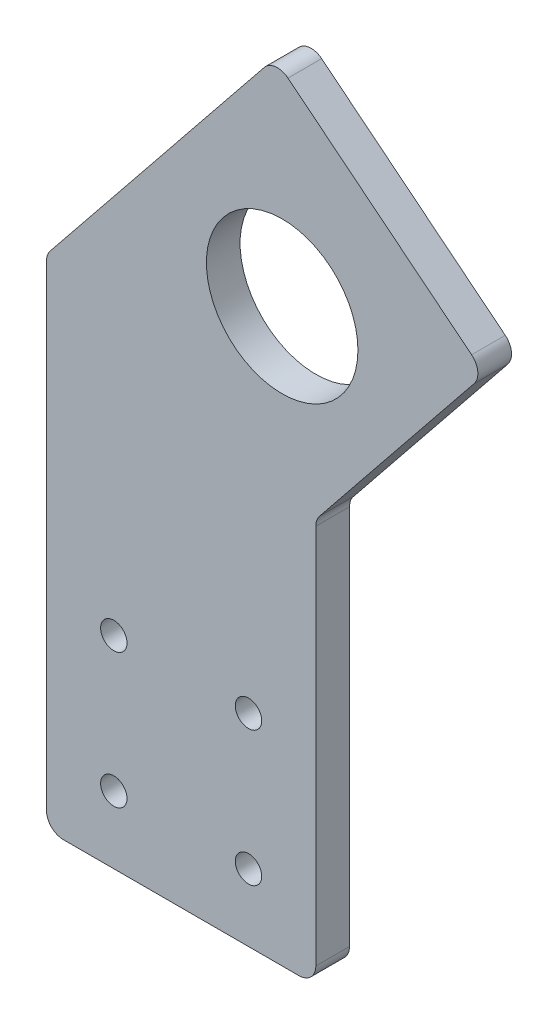
ISO-10303-21;
HEADER;
FILE_DESCRIPTION(('STEP AP214'),'2;1');
FILE_NAME('part.step','',(''),(''),'','','');
FILE_SCHEMA(('AUTOMOTIVE_DESIGN { 1 0 10303 214 1 1 1 1 }'));
ENDSEC;
DATA;
#1=APPLICATION_CONTEXT('core data for automotive mechanical design processes');
#2=APPLICATION_PROTOCOL_DEFINITION('international standard','automotive_design',2000,#1);
#3=PRODUCT_CONTEXT('',#1,'mechanical');
#4=PRODUCT('Part','Part','',(#3));
#5=PRODUCT_RELATED_PRODUCT_CATEGORY('part','',(#4));
#6=PRODUCT_DEFINITION_FORMATION('','',#4);
#7=PRODUCT_DEFINITION_CONTEXT('part definition',#1,'design');
#8=PRODUCT_DEFINITION('design','',#6,#7);
#9=PRODUCT_DEFINITION_SHAPE('','',#8);
#10=(LENGTH_UNIT() NAMED_UNIT(*) SI_UNIT(.MILLI.,.METRE.));
#11=(NAMED_UNIT(*) PLANE_ANGLE_UNIT() SI_UNIT($,.RADIAN.));
#12=(NAMED_UNIT(*) SI_UNIT($,.STERADIAN.) SOLID_ANGLE_UNIT());
#13=UNCERTAINTY_MEASURE_WITH_UNIT(LENGTH_MEASURE(1.E-05),#10,'distance_accuracy_value','');
#14=(GEOMETRIC_REPRESENTATION_CONTEXT(3) GLOBAL_UNCERTAINTY_ASSIGNED_CONTEXT((#13)) GLOBAL_UNIT_ASSIGNED_CONTEXT((#10,
#11,#12)) REPRESENTATION_CONTEXT('',''));
#15=CARTESIAN_POINT('',(0.,0.,0.));
#16=DIRECTION('',(0.,0.,1.));
#17=DIRECTION('',(1.,0.,0.));
#18=AXIS2_PLACEMENT_3D('',#15,#16,#17);
#19=CARTESIAN_POINT('',(596.900000000012,475.406223643939,6.35));
#20=DIRECTION('',(0.,1.,0.));
#21=DIRECTION('',(0.,0.,1.));
#22=AXIS2_PLACEMENT_3D('',#19,#20,#21);
#23=PLANE('',#22);
#24=DIRECTION('',(1.,0.,0.));
#25=VECTOR('',#24,1.);
#26=CARTESIAN_POINT('',(596.900000000012,475.406223643939,6.35));
#27=LINE('',#26,#25);
#28=CARTESIAN_POINT('',(549.275000000012,475.406223643939,6.35));
#29=VERTEX_POINT('',#28);
#30=CARTESIAN_POINT('',(593.725000000012,475.406223643939,6.35));
#31=VERTEX_POINT('',#30);
#32=EDGE_CURVE('E145',#29,#31,#27,.T.);
#33=ORIENTED_EDGE('',*,*,#32,.F.);
#34=DIRECTION('',(0.,0.,-1.));
#35=VECTOR('',#34,1.);
#36=CARTESIAN_POINT('',(549.275000000012,475.406223643939,6.35));
#37=LINE('',#36,#35);
#38=CARTESIAN_POINT('',(549.275000000012,475.406223643939,0.));
#39=VERTEX_POINT('',#38);
#40=EDGE_CURVE('E130',#29,#39,#37,.T.);
#41=ORIENTED_EDGE('',*,*,#40,.T.);
#42=DIRECTION('',(1.,0.,0.));
#43=VECTOR('',#42,1.);
#44=CARTESIAN_POINT('',(596.900000000012,475.406223643939,0.));
#45=LINE('',#44,#43);
#46=CARTESIAN_POINT('',(593.725000000012,475.406223643939,0.));
#47=VERTEX_POINT('',#46);
#48=EDGE_CURVE('E142',#39,#47,#45,.T.);
#49=ORIENTED_EDGE('',*,*,#48,.T.);
#50=DIRECTION('',(0.,0.,-1.));
#51=VECTOR('',#50,1.);
#52=CARTESIAN_POINT('',(593.725000000012,475.406223643939,6.35));
#53=LINE('',#52,#51);
#54=EDGE_CURVE('E147',#47,#31,#53,.F.);
#55=ORIENTED_EDGE('',*,*,#54,.T.);
#56=EDGE_LOOP('',(#33,#41,#49,#55));
#57=FACE_BOUND('',#56,.T.);
#58=ADVANCED_FACE('F36',(#57),#23,.F.);
#59=CARTESIAN_POINT('',(596.900000000012,551.528081058826,6.35));
#60=DIRECTION('',(-1.,0.,0.));
#61=DIRECTION('',(0.,0.,1.));
#62=AXIS2_PLACEMENT_3D('',#59,#60,#61);
#63=PLANE('',#62);
#64=DIRECTION('',(0.,1.,0.));
#65=VECTOR('',#64,1.);
#66=CARTESIAN_POINT('',(596.900000000012,551.528081058826,0.));
#67=LINE('',#66,#65);
#68=CARTESIAN_POINT('',(596.900000000012,478.581223643939,0.));
#69=VERTEX_POINT('',#68);
#70=CARTESIAN_POINT('',(596.900000000012,550.409246189396,0.));
#71=VERTEX_POINT('',#70);
#72=EDGE_CURVE('E152',#69,#71,#67,.T.);
#73=ORIENTED_EDGE('',*,*,#72,.T.);
#74=DIRECTION('',(0.,0.,-1.));
#75=VECTOR('',#74,1.);
#76=CARTESIAN_POINT('',(596.900000000012,550.409246189396,6.35));
#77=LINE('',#76,#75);
#78=CARTESIAN_POINT('',(596.900000000012,550.409246189396,6.35));
#79=VERTEX_POINT('',#78);
#80=EDGE_CURVE('E209',#71,#79,#77,.F.);
#81=ORIENTED_EDGE('',*,*,#80,.T.);
#82=DIRECTION('',(0.,1.,0.));
#83=VECTOR('',#82,1.);
#84=CARTESIAN_POINT('',(596.900000000012,551.528081058826,6.35));
#85=LINE('',#84,#83);
#86=CARTESIAN_POINT('',(596.900000000012,478.581223643939,6.35));
#87=VERTEX_POINT('',#86);
#88=EDGE_CURVE('E227',#87,#79,#85,.T.);
#89=ORIENTED_EDGE('',*,*,#88,.F.);
#90=DIRECTION('',(0.,0.,-1.));
#91=VECTOR('',#90,1.);
#92=CARTESIAN_POINT('',(596.900000000012,478.581223643939,6.35));
#93=LINE('',#92,#91);
#94=EDGE_CURVE('E206',#87,#69,#93,.T.);
#95=ORIENTED_EDGE('',*,*,#94,.T.);
#96=EDGE_LOOP('',(#73,#81,#89,#95));
#97=FACE_BOUND('',#96,.T.);
#98=ADVANCED_FACE('F215',(#97),#63,.F.);
#99=CARTESIAN_POINT('',(628.747907575038,591.105230818411,6.35));
#100=DIRECTION('',(-0.779077751172932,0.626927314469011,0.));
#101=DIRECTION('',(-0.626927314469011,-0.779077751172932,0.));
#102=AXIS2_PLACEMENT_3D('',#99,#100,#101);
#103=PLANE('',#102);
#104=DIRECTION('',(0.626927314469011,0.779077751172932,0.));
#105=VECTOR('',#104,1.);
#106=CARTESIAN_POINT('',(628.747907575038,591.105230818411,6.35));
#107=LINE('',#106,#105);
#108=CARTESIAN_POINT('',(597.601428140038,552.399740412835,6.35));
#109=VERTEX_POINT('',#108);
#110=CARTESIAN_POINT('',(626.757413351599,588.631658958436,6.35));
#111=VERTEX_POINT('',#110);
#112=EDGE_CURVE('E225',#109,#111,#107,.T.);
#113=ORIENTED_EDGE('',*,*,#112,.F.);
#114=DIRECTION('',(0.,0.,-1.));
#115=VECTOR('',#114,1.);
#116=CARTESIAN_POINT('',(597.601428140038,552.399740412835,0.));
#117=LINE('',#116,#115);
#118=CARTESIAN_POINT('',(597.601428140038,552.399740412835,0.));
#119=VERTEX_POINT('',#118);
#120=EDGE_CURVE('E203',#109,#119,#117,.T.);
#121=ORIENTED_EDGE('',*,*,#120,.T.);
#122=DIRECTION('',(0.626927314469011,0.779077751172932,0.));
#123=VECTOR('',#122,1.);
#124=CARTESIAN_POINT('',(628.747907575038,591.105230818411,0.));
#125=LINE('',#124,#123);
#126=CARTESIAN_POINT('',(626.757413351599,588.631658958436,0.));
#127=VERTEX_POINT('',#126);
#128=EDGE_CURVE('E156',#119,#127,#125,.T.);
#129=ORIENTED_EDGE('',*,*,#128,.T.);
#130=DIRECTION('',(0.,0.,-1.));
#131=VECTOR('',#130,1.);
#132=CARTESIAN_POINT('',(626.757413351599,588.631658958436,6.35));
#133=LINE('',#132,#131);
#134=EDGE_CURVE('E201',#127,#111,#133,.F.);
#135=ORIENTED_EDGE('',*,*,#134,.T.);
#136=EDGE_LOOP('',(#113,#121,#129,#135));
#137=FACE_BOUND('',#136,.T.);
#138=ADVANCED_FACE('F229',(#137),#103,.F.);
#139=CARTESIAN_POINT('',(589.170757815453,622.953138393436,6.35));
#140=DIRECTION('',(-0.626927314469011,-0.779077751172932,0.));
#141=DIRECTION('',(0.779077751172932,-0.626927314469011,0.));
#142=AXIS2_PLACEMENT_3D('',#139,#140,#141);
#143=PLANE('',#142);
#144=DIRECTION('',(-0.779077751172932,0.626927314469011,0.));
#145=VECTOR('',#144,1.);
#146=CARTESIAN_POINT('',(589.170757815453,622.953138393436,0.));
#147=LINE('',#146,#145);
#148=CARTESIAN_POINT('',(626.274335715064,593.09572504185,0.));
#149=VERTEX_POINT('',#148);
#150=CARTESIAN_POINT('',(591.644329675427,620.962644169997,0.));
#151=VERTEX_POINT('',#150);
#152=EDGE_CURVE('E167',#149,#151,#147,.T.);
#153=ORIENTED_EDGE('',*,*,#152,.T.);
#154=DIRECTION('',(0.,0.,-1.));
#155=VECTOR('',#154,1.);
#156=CARTESIAN_POINT('',(591.644329675427,620.962644169997,6.35));
#157=LINE('',#156,#155);
#158=CARTESIAN_POINT('',(591.644329675427,620.962644169997,6.35));
#159=VERTEX_POINT('',#158);
#160=EDGE_CURVE('E199',#151,#159,#157,.F.);
#161=ORIENTED_EDGE('',*,*,#160,.T.);
#162=DIRECTION('',(-0.779077751172932,0.626927314469011,0.));
#163=VECTOR('',#162,1.);
#164=CARTESIAN_POINT('',(589.170757815453,622.953138393436,6.35));
#165=LINE('',#164,#163);
#166=CARTESIAN_POINT('',(626.274335715064,593.09572504185,6.35));
#167=VERTEX_POINT('',#166);
#168=EDGE_CURVE('E231',#167,#159,#165,.T.);
#169=ORIENTED_EDGE('',*,*,#168,.F.);
#170=DIRECTION('',(0.,0.,-1.));
#171=VECTOR('',#170,1.);
#172=CARTESIAN_POINT('',(626.274335715064,593.09572504185,6.35));
#173=LINE('',#172,#171);
#174=EDGE_CURVE('E196',#167,#149,#173,.T.);
#175=ORIENTED_EDGE('',*,*,#174,.T.);
#176=EDGE_LOOP('',(#153,#161,#169,#175));
#177=FACE_BOUND('',#176,.T.);
#178=ADVANCED_FACE('F252',(#177),#143,.F.);
#179=CARTESIAN_POINT('',(546.100000000012,569.429438969703,6.35));
#180=DIRECTION('',(0.779077751172932,-0.626927314469012,0.));
#181=DIRECTION('',(0.626927314469012,0.779077751172932,0.));
#182=AXIS2_PLACEMENT_3D('',#179,#180,#181);
#183=PLANE('',#182);
#184=DIRECTION('',(-0.626927314469012,-0.779077751172932,0.));
#185=VECTOR('',#184,1.);
#186=CARTESIAN_POINT('',(546.100000000012,569.429438969703,0.));
#187=LINE('',#186,#185);
#188=CARTESIAN_POINT('',(587.180263592014,620.479566533462,0.));
#189=VERTEX_POINT('',#188);
#190=CARTESIAN_POINT('',(546.801428140038,570.301098323712,0.));
#191=VERTEX_POINT('',#190);
#192=EDGE_CURVE('E170',#189,#191,#187,.T.);
#193=ORIENTED_EDGE('',*,*,#192,.T.);
#194=DIRECTION('',(0.,0.,-1.));
#195=VECTOR('',#194,1.);
#196=CARTESIAN_POINT('',(546.801428140038,570.301098323712,6.35));
#197=LINE('',#196,#195);
#198=CARTESIAN_POINT('',(546.801428140038,570.301098323712,6.35));
#199=VERTEX_POINT('',#198);
#200=EDGE_CURVE('E51',#191,#199,#197,.F.);
#201=ORIENTED_EDGE('',*,*,#200,.T.);
#202=DIRECTION('',(-0.626927314469012,-0.779077751172932,0.));
#203=VECTOR('',#202,1.);
#204=CARTESIAN_POINT('',(546.100000000012,569.429438969703,6.35));
#205=LINE('',#204,#203);
#206=CARTESIAN_POINT('',(587.180263592014,620.479566533462,6.35));
#207=VERTEX_POINT('',#206);
#208=EDGE_CURVE('E233',#207,#199,#205,.T.);
#209=ORIENTED_EDGE('',*,*,#208,.F.);
#210=DIRECTION('',(0.,0.,-1.));
#211=VECTOR('',#210,1.);
#212=CARTESIAN_POINT('',(587.180263592014,620.479566533462,6.35));
#213=LINE('',#212,#211);
#214=EDGE_CURVE('E192',#207,#189,#213,.T.);
#215=ORIENTED_EDGE('',*,*,#214,.T.);
#216=EDGE_LOOP('',(#193,#201,#209,#215));
#217=FACE_BOUND('',#216,.T.);
#218=ADVANCED_FACE('F245',(#217),#183,.F.);
#219=CARTESIAN_POINT('',(546.100000000012,475.406223643939,6.35));
#220=DIRECTION('',(1.,0.,0.));
#221=DIRECTION('',(0.,0.,-1.));
#222=AXIS2_PLACEMENT_3D('',#219,#220,#221);
#223=PLANE('',#222);
#224=DIRECTION('',(0.,-1.,0.));
#225=VECTOR('',#224,1.);
#226=CARTESIAN_POINT('',(546.100000000012,475.406223643939,0.));
#227=LINE('',#226,#225);
#228=CARTESIAN_POINT('',(546.100000000012,568.310604100273,0.));
#229=VERTEX_POINT('',#228);
#230=CARTESIAN_POINT('',(546.100000000012,478.581223643939,0.));
#231=VERTEX_POINT('',#230);
#232=EDGE_CURVE('E172',#229,#231,#227,.T.);
#233=ORIENTED_EDGE('',*,*,#232,.T.);
#234=DIRECTION('',(0.,0.,-1.));
#235=VECTOR('',#234,1.);
#236=CARTESIAN_POINT('',(546.100000000012,478.581223643939,6.35));
#237=LINE('',#236,#235);
#238=CARTESIAN_POINT('',(546.100000000012,478.581223643939,6.35));
#239=VERTEX_POINT('',#238);
#240=EDGE_CURVE('E131',#231,#239,#237,.F.);
#241=ORIENTED_EDGE('',*,*,#240,.T.);
#242=DIRECTION('',(0.,-1.,0.));
#243=VECTOR('',#242,1.);
#244=CARTESIAN_POINT('',(546.100000000012,475.406223643939,6.35));
#245=LINE('',#244,#243);
#246=CARTESIAN_POINT('',(546.100000000012,568.310604100273,6.35));
#247=VERTEX_POINT('',#246);
#248=EDGE_CURVE('E162',#247,#239,#245,.T.);
#249=ORIENTED_EDGE('',*,*,#248,.F.);
#250=DIRECTION('',(0.,0.,-1.));
#251=VECTOR('',#250,1.);
#252=CARTESIAN_POINT('',(546.100000000012,568.310604100273,6.35));
#253=LINE('',#252,#251);
#254=EDGE_CURVE('E136',#247,#229,#253,.T.);
#255=ORIENTED_EDGE('',*,*,#254,.T.);
#256=EDGE_LOOP('',(#233,#241,#249,#255));
#257=FACE_BOUND('',#256,.T.);
#258=ADVANCED_FACE('F241',(#257),#223,.F.);
#259=CARTESIAN_POINT('',(0.,0.,6.35));
#260=DIRECTION('',(0.,0.,-1.));
#261=DIRECTION('',(-1.,0.,0.));
#262=AXIS2_PLACEMENT_3D('',#259,#260,#261);
#263=PLANE('',#262);
#264=CARTESIAN_POINT('',(584.200000000012,488.106223643939,6.35));
#265=DIRECTION('',(0.,0.,1.));
#266=DIRECTION('',(1.,0.,0.));
#267=AXIS2_PLACEMENT_3D('',#264,#265,#266);
#268=CIRCLE('',#267,2.48919999999995);
#269=CARTESIAN_POINT('',(586.689200000012,488.106223643939,6.35));
#270=VERTEX_POINT('',#269);
#271=EDGE_CURVE('E473',#270,#270,#268,.T.);
#272=ORIENTED_EDGE('',*,*,#271,.F.);
#273=EDGE_LOOP('',(#272));
#274=FACE_BOUND('',#273,.T.);
#275=CARTESIAN_POINT('',(584.200000000012,513.506223643939,6.35));
#276=DIRECTION('',(0.,0.,1.));
#277=DIRECTION('',(1.,0.,0.));
#278=AXIS2_PLACEMENT_3D('',#275,#276,#277);
#279=CIRCLE('',#278,2.48919999999994);
#280=CARTESIAN_POINT('',(586.689200000012,513.506223643939,6.35));
#281=VERTEX_POINT('',#280);
#282=EDGE_CURVE('E479',#281,#281,#279,.T.);
#283=ORIENTED_EDGE('',*,*,#282,.F.);
#284=EDGE_LOOP('',(#283));
#285=FACE_BOUND('',#284,.T.);
#286=CARTESIAN_POINT('',(558.800000000012,513.506223643939,6.35));
#287=DIRECTION('',(0.,0.,1.));
#288=DIRECTION('',(1.,0.,0.));
#289=AXIS2_PLACEMENT_3D('',#286,#287,#288);
#290=CIRCLE('',#289,2.48919999999994);
#291=CARTESIAN_POINT('',(561.289200000012,513.506223643939,6.35));
#292=VERTEX_POINT('',#291);
#293=EDGE_CURVE('E485',#292,#292,#290,.T.);
#294=ORIENTED_EDGE('',*,*,#293,.F.);
#295=EDGE_LOOP('',(#294));
#296=FACE_BOUND('',#295,.T.);
#297=CARTESIAN_POINT('',(558.800000000012,488.106223643939,6.35));
#298=DIRECTION('',(0.,0.,1.));
#299=DIRECTION('',(1.,0.,0.));
#300=AXIS2_PLACEMENT_3D('',#297,#298,#299);
#301=CIRCLE('',#300,2.48919999999995);
#302=CARTESIAN_POINT('',(561.289200000012,488.106223643939,6.35));
#303=VERTEX_POINT('',#302);
#304=EDGE_CURVE('E463',#303,#303,#301,.T.);
#305=ORIENTED_EDGE('',*,*,#304,.F.);
#306=EDGE_LOOP('',(#305));
#307=FACE_BOUND('',#306,.T.);
#308=CARTESIAN_POINT('',(590.550000000012,583.139171886535,6.35));
#309=DIRECTION('',(0.,0.,1.));
#310=DIRECTION('',(1.,0.,0.));
#311=AXIS2_PLACEMENT_3D('',#308,#309,#310);
#312=CIRCLE('',#311,14.2875);
#313=CARTESIAN_POINT('',(604.837500000012,583.139171886535,6.35));
#314=VERTEX_POINT('',#313);
#315=EDGE_CURVE('E159',#314,#314,#312,.T.);
#316=ORIENTED_EDGE('',*,*,#315,.F.);
#317=EDGE_LOOP('',(#316));
#318=FACE_BOUND('',#317,.T.);
#319=ORIENTED_EDGE('',*,*,#248,.T.);
#320=CARTESIAN_POINT('',(549.275000000012,478.581223643939,6.35));
#321=DIRECTION('',(0.,0.,-1.));
#322=DIRECTION('',(-1.,0.,0.));
#323=AXIS2_PLACEMENT_3D('',#320,#321,#322);
#324=CIRCLE('',#323,3.175);
#325=EDGE_CURVE('E190',#239,#29,#324,.F.);
#326=ORIENTED_EDGE('',*,*,#325,.T.);
#327=ORIENTED_EDGE('',*,*,#32,.T.);
#328=CARTESIAN_POINT('',(593.725000000012,478.581223643939,6.35));
#329=DIRECTION('',(0.,0.,-1.));
#330=DIRECTION('',(-1.,0.,0.));
#331=AXIS2_PLACEMENT_3D('',#328,#329,#330);
#332=CIRCLE('',#331,3.175);
#333=EDGE_CURVE('E185',#31,#87,#332,.F.);
#334=ORIENTED_EDGE('',*,*,#333,.T.);
#335=ORIENTED_EDGE('',*,*,#88,.T.);
#336=CARTESIAN_POINT('',(600.075000000012,550.409246189396,6.35));
#337=DIRECTION('',(0.,0.,-1.));
#338=DIRECTION('',(-1.,0.,0.));
#339=AXIS2_PLACEMENT_3D('',#336,#337,#338);
#340=CIRCLE('',#339,3.175);
#341=EDGE_CURVE('E11',#79,#109,#340,.T.);
#342=ORIENTED_EDGE('',*,*,#341,.T.);
#343=ORIENTED_EDGE('',*,*,#112,.T.);
#344=CARTESIAN_POINT('',(624.283841491625,590.622153181876,6.35));
#345=DIRECTION('',(0.,0.,-1.));
#346=DIRECTION('',(-1.,0.,0.));
#347=AXIS2_PLACEMENT_3D('',#344,#345,#346);
#348=CIRCLE('',#347,3.175);
#349=EDGE_CURVE('E183',#111,#167,#348,.F.);
#350=ORIENTED_EDGE('',*,*,#349,.T.);
#351=ORIENTED_EDGE('',*,*,#168,.T.);
#352=CARTESIAN_POINT('',(589.653835451988,618.489072310023,6.35));
#353=DIRECTION('',(0.,0.,-1.));
#354=DIRECTION('',(-1.,0.,0.));
#355=AXIS2_PLACEMENT_3D('',#352,#353,#354);
#356=CIRCLE('',#355,3.175);
#357=EDGE_CURVE('E58',#159,#207,#356,.F.);
#358=ORIENTED_EDGE('',*,*,#357,.T.);
#359=ORIENTED_EDGE('',*,*,#208,.T.);
#360=CARTESIAN_POINT('',(549.275000000012,568.310604100273,6.35));
#361=DIRECTION('',(0.,0.,-1.));
#362=DIRECTION('',(-1.,0.,0.));
#363=AXIS2_PLACEMENT_3D('',#360,#361,#362);
#364=CIRCLE('',#363,3.175);
#365=EDGE_CURVE('E188',#199,#247,#364,.F.);
#366=ORIENTED_EDGE('',*,*,#365,.T.);
#367=EDGE_LOOP('',(#319,#326,#327,#334,#335,#342,#343,#350,#351,#358,#359,#366));
#368=FACE_BOUND('',#367,.T.);
#369=ADVANCED_FACE('F224',(#274,#285,#296,#307,#318,#368),#263,.F.);
#370=CARTESIAN_POINT('',(0.,0.,0.));
#371=DIRECTION('',(0.,0.,-1.));
#372=DIRECTION('',(-1.,0.,0.));
#373=AXIS2_PLACEMENT_3D('',#370,#371,#372);
#374=PLANE('',#373);
#375=CARTESIAN_POINT('',(584.200000000012,488.106223643939,0.));
#376=DIRECTION('',(0.,0.,1.));
#377=DIRECTION('',(1.,0.,0.));
#378=AXIS2_PLACEMENT_3D('',#375,#376,#377);
#379=CIRCLE('',#378,2.48919999999995);
#380=CARTESIAN_POINT('',(586.689200000012,488.106223643939,0.));
#381=VERTEX_POINT('',#380);
#382=EDGE_CURVE('E476',#381,#381,#379,.T.);
#383=ORIENTED_EDGE('',*,*,#382,.T.);
#384=EDGE_LOOP('',(#383));
#385=FACE_BOUND('',#384,.T.);
#386=CARTESIAN_POINT('',(584.200000000012,513.506223643939,0.));
#387=DIRECTION('',(0.,0.,1.));
#388=DIRECTION('',(1.,0.,0.));
#389=AXIS2_PLACEMENT_3D('',#386,#387,#388);
#390=CIRCLE('',#389,2.48919999999994);
#391=CARTESIAN_POINT('',(586.689200000012,513.506223643939,0.));
#392=VERTEX_POINT('',#391);
#393=EDGE_CURVE('E482',#392,#392,#390,.T.);
#394=ORIENTED_EDGE('',*,*,#393,.T.);
#395=EDGE_LOOP('',(#394));
#396=FACE_BOUND('',#395,.T.);
#397=CARTESIAN_POINT('',(558.800000000012,513.506223643939,0.));
#398=DIRECTION('',(0.,0.,1.));
#399=DIRECTION('',(1.,0.,0.));
#400=AXIS2_PLACEMENT_3D('',#397,#398,#399);
#401=CIRCLE('',#400,2.48919999999994);
#402=CARTESIAN_POINT('',(561.289200000012,513.506223643939,0.));
#403=VERTEX_POINT('',#402);
#404=EDGE_CURVE('E471',#403,#403,#401,.T.);
#405=ORIENTED_EDGE('',*,*,#404,.T.);
#406=EDGE_LOOP('',(#405));
#407=FACE_BOUND('',#406,.T.);
#408=CARTESIAN_POINT('',(558.800000000012,488.106223643939,0.));
#409=DIRECTION('',(0.,0.,1.));
#410=DIRECTION('',(1.,0.,0.));
#411=AXIS2_PLACEMENT_3D('',#408,#409,#410);
#412=CIRCLE('',#411,2.48919999999995);
#413=CARTESIAN_POINT('',(561.289200000012,488.106223643939,0.));
#414=VERTEX_POINT('',#413);
#415=EDGE_CURVE('E466',#414,#414,#412,.T.);
#416=ORIENTED_EDGE('',*,*,#415,.T.);
#417=EDGE_LOOP('',(#416));
#418=FACE_BOUND('',#417,.T.);
#419=CARTESIAN_POINT('',(590.550000000012,583.139171886535,0.));
#420=DIRECTION('',(0.,0.,1.));
#421=DIRECTION('',(1.,0.,0.));
#422=AXIS2_PLACEMENT_3D('',#419,#420,#421);
#423=CIRCLE('',#422,14.2875);
#424=CARTESIAN_POINT('',(604.837500000012,583.139171886535,0.));
#425=VERTEX_POINT('',#424);
#426=EDGE_CURVE('E153',#425,#425,#423,.T.);
#427=ORIENTED_EDGE('',*,*,#426,.T.);
#428=EDGE_LOOP('',(#427));
#429=FACE_BOUND('',#428,.T.);
#430=ORIENTED_EDGE('',*,*,#48,.F.);
#431=CARTESIAN_POINT('',(549.275000000012,478.581223643939,0.));
#432=DIRECTION('',(0.,0.,-1.));
#433=DIRECTION('',(-1.,0.,0.));
#434=AXIS2_PLACEMENT_3D('',#431,#432,#433);
#435=CIRCLE('',#434,3.175);
#436=EDGE_CURVE('E126',#39,#231,#435,.T.);
#437=ORIENTED_EDGE('',*,*,#436,.T.);
#438=ORIENTED_EDGE('',*,*,#232,.F.);
#439=CARTESIAN_POINT('',(549.275000000012,568.310604100273,0.));
#440=DIRECTION('',(0.,0.,-1.));
#441=DIRECTION('',(-1.,0.,0.));
#442=AXIS2_PLACEMENT_3D('',#439,#440,#441);
#443=CIRCLE('',#442,3.175);
#444=EDGE_CURVE('E137',#229,#191,#443,.T.);
#445=ORIENTED_EDGE('',*,*,#444,.T.);
#446=ORIENTED_EDGE('',*,*,#192,.F.);
#447=CARTESIAN_POINT('',(589.653835451988,618.489072310023,0.));
#448=DIRECTION('',(0.,0.,-1.));
#449=DIRECTION('',(-1.,0.,0.));
#450=AXIS2_PLACEMENT_3D('',#447,#448,#449);
#451=CIRCLE('',#450,3.175);
#452=EDGE_CURVE('E177',#189,#151,#451,.T.);
#453=ORIENTED_EDGE('',*,*,#452,.T.);
#454=ORIENTED_EDGE('',*,*,#152,.F.);
#455=CARTESIAN_POINT('',(624.283841491625,590.622153181876,0.));
#456=DIRECTION('',(0.,0.,-1.));
#457=DIRECTION('',(-1.,0.,0.));
#458=AXIS2_PLACEMENT_3D('',#455,#456,#457);
#459=CIRCLE('',#458,3.175);
#460=EDGE_CURVE('E146',#149,#127,#459,.T.);
#461=ORIENTED_EDGE('',*,*,#460,.T.);
#462=ORIENTED_EDGE('',*,*,#128,.F.);
#463=CARTESIAN_POINT('',(600.075000000012,550.409246189396,0.));
#464=DIRECTION('',(0.,0.,-1.));
#465=DIRECTION('',(-1.,0.,0.));
#466=AXIS2_PLACEMENT_3D('',#463,#464,#465);
#467=CIRCLE('',#466,3.175);
#468=EDGE_CURVE('E44',#119,#71,#467,.F.);
#469=ORIENTED_EDGE('',*,*,#468,.T.);
#470=ORIENTED_EDGE('',*,*,#72,.F.);
#471=CARTESIAN_POINT('',(593.725000000012,478.581223643939,0.));
#472=DIRECTION('',(0.,0.,-1.));
#473=DIRECTION('',(-1.,0.,0.));
#474=AXIS2_PLACEMENT_3D('',#471,#472,#473);
#475=CIRCLE('',#474,3.175);
#476=EDGE_CURVE('E151',#69,#47,#475,.T.);
#477=ORIENTED_EDGE('',*,*,#476,.T.);
#478=EDGE_LOOP('',(#430,#437,#438,#445,#446,#453,#454,#461,#462,#469,#470,#477));
#479=FACE_BOUND('',#478,.T.);
#480=ADVANCED_FACE('F149',(#385,#396,#407,#418,#429,#479),#374,.T.);
#481=CARTESIAN_POINT('',(590.550000000012,583.139171886535,0.));
#482=DIRECTION('',(0.,0.,1.));
#483=DIRECTION('',(1.,0.,0.));
#484=AXIS2_PLACEMENT_3D('',#481,#482,#483);
#485=CYLINDRICAL_SURFACE('',#484,14.2875);
#486=ORIENTED_EDGE('',*,*,#426,.F.);
#487=EDGE_LOOP('',(#486));
#488=FACE_BOUND('',#487,.T.);
#489=ORIENTED_EDGE('',*,*,#315,.T.);
#490=EDGE_LOOP('',(#489));
#491=FACE_BOUND('',#490,.T.);
#492=ADVANCED_FACE('F277',(#488,#491),#485,.F.);
#493=CARTESIAN_POINT('',(549.275000000012,478.581223643939,6.35));
#494=DIRECTION('',(0.,0.,-1.));
#495=DIRECTION('',(-1.,0.,0.));
#496=AXIS2_PLACEMENT_3D('',#493,#494,#495);
#497=CYLINDRICAL_SURFACE('',#496,3.175);
#498=ORIENTED_EDGE('',*,*,#325,.F.);
#499=ORIENTED_EDGE('',*,*,#240,.F.);
#500=ORIENTED_EDGE('',*,*,#436,.F.);
#501=ORIENTED_EDGE('',*,*,#40,.F.);
#502=EDGE_LOOP('',(#498,#499,#500,#501));
#503=FACE_BOUND('',#502,.T.);
#504=ADVANCED_FACE('F129',(#503),#497,.T.);
#505=CARTESIAN_POINT('',(549.275000000012,568.310604100273,6.35));
#506=DIRECTION('',(0.,0.,-1.));
#507=DIRECTION('',(-1.,0.,0.));
#508=AXIS2_PLACEMENT_3D('',#505,#506,#507);
#509=CYLINDRICAL_SURFACE('',#508,3.175);
#510=ORIENTED_EDGE('',*,*,#365,.F.);
#511=ORIENTED_EDGE('',*,*,#200,.F.);
#512=ORIENTED_EDGE('',*,*,#444,.F.);
#513=ORIENTED_EDGE('',*,*,#254,.F.);
#514=EDGE_LOOP('',(#510,#511,#512,#513));
#515=FACE_BOUND('',#514,.T.);
#516=ADVANCED_FACE('F243',(#515),#509,.T.);
#517=CARTESIAN_POINT('',(589.653835451988,618.489072310023,6.35));
#518=DIRECTION('',(0.,0.,-1.));
#519=DIRECTION('',(-1.,0.,0.));
#520=AXIS2_PLACEMENT_3D('',#517,#518,#519);
#521=CYLINDRICAL_SURFACE('',#520,3.175);
#522=ORIENTED_EDGE('',*,*,#357,.F.);
#523=ORIENTED_EDGE('',*,*,#160,.F.);
#524=ORIENTED_EDGE('',*,*,#452,.F.);
#525=ORIENTED_EDGE('',*,*,#214,.F.);
#526=EDGE_LOOP('',(#522,#523,#524,#525));
#527=FACE_BOUND('',#526,.T.);
#528=ADVANCED_FACE('F248',(#527),#521,.T.);
#529=CARTESIAN_POINT('',(600.075000000012,550.409246189396,6.35));
#530=DIRECTION('',(0.,0.,1.));
#531=DIRECTION('',(1.,0.,0.));
#532=AXIS2_PLACEMENT_3D('',#529,#530,#531);
#533=CYLINDRICAL_SURFACE('',#532,3.175);
#534=ORIENTED_EDGE('',*,*,#341,.F.);
#535=ORIENTED_EDGE('',*,*,#80,.F.);
#536=ORIENTED_EDGE('',*,*,#468,.F.);
#537=ORIENTED_EDGE('',*,*,#120,.F.);
#538=EDGE_LOOP('',(#534,#535,#536,#537));
#539=FACE_BOUND('',#538,.T.);
#540=ADVANCED_FACE('F220',(#539),#533,.F.);
#541=CARTESIAN_POINT('',(593.725000000012,478.581223643939,6.35));
#542=DIRECTION('',(0.,0.,-1.));
#543=DIRECTION('',(-1.,0.,0.));
#544=AXIS2_PLACEMENT_3D('',#541,#542,#543);
#545=CYLINDRICAL_SURFACE('',#544,3.175);
#546=ORIENTED_EDGE('',*,*,#333,.F.);
#547=ORIENTED_EDGE('',*,*,#54,.F.);
#548=ORIENTED_EDGE('',*,*,#476,.F.);
#549=ORIENTED_EDGE('',*,*,#94,.F.);
#550=EDGE_LOOP('',(#546,#547,#548,#549));
#551=FACE_BOUND('',#550,.T.);
#552=ADVANCED_FACE('F258',(#551),#545,.T.);
#553=CARTESIAN_POINT('',(624.283841491625,590.622153181876,6.35));
#554=DIRECTION('',(0.,0.,-1.));
#555=DIRECTION('',(-1.,0.,0.));
#556=AXIS2_PLACEMENT_3D('',#553,#554,#555);
#557=CYLINDRICAL_SURFACE('',#556,3.175);
#558=ORIENTED_EDGE('',*,*,#349,.F.);
#559=ORIENTED_EDGE('',*,*,#134,.F.);
#560=ORIENTED_EDGE('',*,*,#460,.F.);
#561=ORIENTED_EDGE('',*,*,#174,.F.);
#562=EDGE_LOOP('',(#558,#559,#560,#561));
#563=FACE_BOUND('',#562,.T.);
#564=ADVANCED_FACE('F38',(#563),#557,.T.);
#565=CARTESIAN_POINT('',(558.800000000012,488.106223643939,6.35));
#566=DIRECTION('',(0.,0.,-1.));
#567=DIRECTION('',(-1.,0.,0.));
#568=AXIS2_PLACEMENT_3D('',#565,#566,#567);
#569=CYLINDRICAL_SURFACE('',#568,2.48919999999995);
#570=ORIENTED_EDGE('',*,*,#304,.T.);
#571=EDGE_LOOP('',(#570));
#572=FACE_BOUND('',#571,.T.);
#573=ORIENTED_EDGE('',*,*,#415,.F.);
#574=EDGE_LOOP('',(#573));
#575=FACE_BOUND('',#574,.T.);
#576=ADVANCED_FACE('F257',(#572,#575),#569,.F.);
#577=CARTESIAN_POINT('',(558.800000000012,513.506223643939,6.35));
#578=DIRECTION('',(0.,0.,-1.));
#579=DIRECTION('',(-1.,0.,0.));
#580=AXIS2_PLACEMENT_3D('',#577,#578,#579);
#581=CYLINDRICAL_SURFACE('',#580,2.48919999999994);
#582=ORIENTED_EDGE('',*,*,#293,.T.);
#583=EDGE_LOOP('',(#582));
#584=FACE_BOUND('',#583,.T.);
#585=ORIENTED_EDGE('',*,*,#404,.F.);
#586=EDGE_LOOP('',(#585));
#587=FACE_BOUND('',#586,.T.);
#588=ADVANCED_FACE('F263',(#584,#587),#581,.F.);
#589=CARTESIAN_POINT('',(584.200000000012,513.506223643939,6.35));
#590=DIRECTION('',(0.,0.,-1.));
#591=DIRECTION('',(-1.,0.,0.));
#592=AXIS2_PLACEMENT_3D('',#589,#590,#591);
#593=CYLINDRICAL_SURFACE('',#592,2.48919999999994);
#594=ORIENTED_EDGE('',*,*,#282,.T.);
#595=EDGE_LOOP('',(#594));
#596=FACE_BOUND('',#595,.T.);
#597=ORIENTED_EDGE('',*,*,#393,.F.);
#598=EDGE_LOOP('',(#597));
#599=FACE_BOUND('',#598,.T.);
#600=ADVANCED_FACE('F337',(#596,#599),#593,.F.);
#601=CARTESIAN_POINT('',(584.200000000012,488.106223643939,6.35));
#602=DIRECTION('',(0.,0.,-1.));
#603=DIRECTION('',(-1.,0.,0.));
#604=AXIS2_PLACEMENT_3D('',#601,#602,#603);
#605=CYLINDRICAL_SURFACE('',#604,2.48919999999995);
#606=ORIENTED_EDGE('',*,*,#271,.T.);
#607=EDGE_LOOP('',(#606));
#608=FACE_BOUND('',#607,.T.);
#609=ORIENTED_EDGE('',*,*,#382,.F.);
#610=EDGE_LOOP('',(#609));
#611=FACE_BOUND('',#610,.T.);
#612=ADVANCED_FACE('F348',(#608,#611),#605,.F.);
#613=CLOSED_SHELL('',(#58,#98,#138,#178,#218,#258,#369,#480,#492,#504,#516,#528,#540,#552,#564,
#576,#588,#600,#612));
#614=MANIFOLD_SOLID_BREP('B2',#613);
#615=ADVANCED_BREP_SHAPE_REPRESENTATION('',(#18,#614),#14);
#616=SHAPE_DEFINITION_REPRESENTATION(#9,#615);
ENDSEC;
END-ISO-10303-21;
